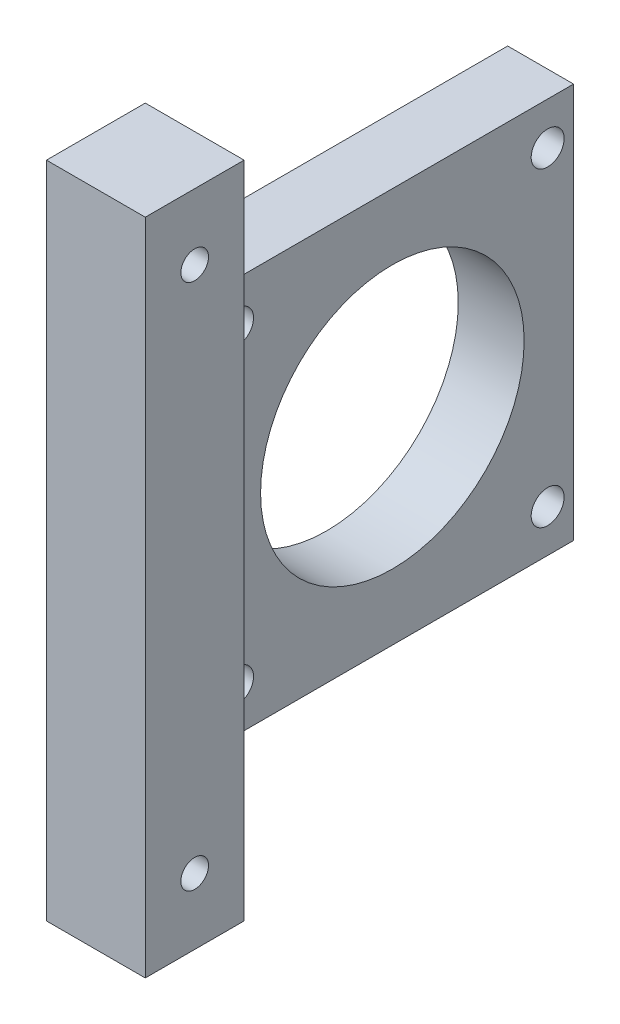
ISO-10303-21;
HEADER;
FILE_DESCRIPTION(('STEP AP214'),'2;1');
FILE_NAME('part.step','',(''),(''),'','','');
FILE_SCHEMA(('AUTOMOTIVE_DESIGN { 1 0 10303 214 1 1 1 1 }'));
ENDSEC;
DATA;
#1=APPLICATION_CONTEXT('core data for automotive mechanical design processes');
#2=APPLICATION_PROTOCOL_DEFINITION('international standard','automotive_design',2000,#1);
#3=PRODUCT_CONTEXT('',#1,'mechanical');
#4=PRODUCT('Part','Part','',(#3));
#5=PRODUCT_RELATED_PRODUCT_CATEGORY('part','',(#4));
#6=PRODUCT_DEFINITION_FORMATION('','',#4);
#7=PRODUCT_DEFINITION_CONTEXT('part definition',#1,'design');
#8=PRODUCT_DEFINITION('design','',#6,#7);
#9=PRODUCT_DEFINITION_SHAPE('','',#8);
#10=(LENGTH_UNIT() NAMED_UNIT(*) SI_UNIT(.MILLI.,.METRE.));
#11=(NAMED_UNIT(*) PLANE_ANGLE_UNIT() SI_UNIT($,.RADIAN.));
#12=(NAMED_UNIT(*) SI_UNIT($,.STERADIAN.) SOLID_ANGLE_UNIT());
#13=UNCERTAINTY_MEASURE_WITH_UNIT(LENGTH_MEASURE(1.E-05),#10,'distance_accuracy_value','');
#14=(GEOMETRIC_REPRESENTATION_CONTEXT(3) GLOBAL_UNCERTAINTY_ASSIGNED_CONTEXT((#13)) GLOBAL_UNIT_ASSIGNED_CONTEXT((#10,
#11,#12)) REPRESENTATION_CONTEXT('',''));
#15=CARTESIAN_POINT('',(0.,0.,0.));
#16=DIRECTION('',(0.,0.,1.));
#17=DIRECTION('',(1.,0.,0.));
#18=AXIS2_PLACEMENT_3D('',#15,#16,#17);
#19=CARTESIAN_POINT('',(10.,0.,0.));
#20=DIRECTION('',(1.,0.,0.));
#21=DIRECTION('',(0.,0.,-1.));
#22=AXIS2_PLACEMENT_3D('',#19,#20,#21);
#23=PLANE('',#22);
#24=CARTESIAN_POINT('',(10.,-23.57,-23.57));
#25=DIRECTION('',(1.,0.,0.));
#26=DIRECTION('',(0.,0.,-1.));
#27=AXIS2_PLACEMENT_3D('',#24,#25,#26);
#28=CIRCLE('',#27,2.5);
#29=CARTESIAN_POINT('',(10.,-23.57,-26.07));
#30=VERTEX_POINT('',#29);
#31=EDGE_CURVE('E126',#30,#30,#28,.T.);
#32=ORIENTED_EDGE('',*,*,#31,.F.);
#33=EDGE_LOOP('',(#32));
#34=FACE_BOUND('',#33,.T.);
#35=CARTESIAN_POINT('',(10.,23.57,23.57));
#36=DIRECTION('',(1.,0.,0.));
#37=DIRECTION('',(0.,0.,-1.));
#38=AXIS2_PLACEMENT_3D('',#35,#36,#37);
#39=CIRCLE('',#38,2.5);
#40=CARTESIAN_POINT('',(10.,23.57,21.07));
#41=VERTEX_POINT('',#40);
#42=EDGE_CURVE('E138',#41,#41,#39,.T.);
#43=ORIENTED_EDGE('',*,*,#42,.F.);
#44=EDGE_LOOP('',(#43));
#45=FACE_BOUND('',#44,.T.);
#46=DIRECTION('',(0.,-1.,0.));
#47=VECTOR('',#46,1.);
#48=CARTESIAN_POINT('',(10.,-30.,27.5));
#49=LINE('',#48,#47);
#50=CARTESIAN_POINT('',(10.,30.,27.5));
#51=VERTEX_POINT('',#50);
#52=CARTESIAN_POINT('',(10.,-30.,27.5));
#53=VERTEX_POINT('',#52);
#54=EDGE_CURVE('E149',#51,#53,#49,.T.);
#55=ORIENTED_EDGE('',*,*,#54,.T.);
#56=DIRECTION('',(0.,0.,-1.));
#57=VECTOR('',#56,1.);
#58=CARTESIAN_POINT('',(10.,-30.,-27.5));
#59=LINE('',#58,#57);
#60=CARTESIAN_POINT('',(10.,-30.,-27.5));
#61=VERTEX_POINT('',#60);
#62=EDGE_CURVE('E59',#53,#61,#59,.T.);
#63=ORIENTED_EDGE('',*,*,#62,.T.);
#64=DIRECTION('',(0.,1.,0.));
#65=VECTOR('',#64,1.);
#66=CARTESIAN_POINT('',(10.,-30.,-27.5));
#67=LINE('',#66,#65);
#68=CARTESIAN_POINT('',(10.,30.,-27.5));
#69=VERTEX_POINT('',#68);
#70=EDGE_CURVE('E153',#61,#69,#67,.T.);
#71=ORIENTED_EDGE('',*,*,#70,.T.);
#72=DIRECTION('',(0.,0.,1.));
#73=VECTOR('',#72,1.);
#74=CARTESIAN_POINT('',(10.,30.,-27.5));
#75=LINE('',#74,#73);
#76=EDGE_CURVE('E34',#69,#51,#75,.T.);
#77=ORIENTED_EDGE('',*,*,#76,.T.);
#78=EDGE_LOOP('',(#55,#63,#71,#77));
#79=FACE_BOUND('',#78,.T.);
#80=CARTESIAN_POINT('',(10.,0.,0.));
#81=DIRECTION('',(1.,0.,0.));
#82=DIRECTION('',(0.,0.,-1.));
#83=AXIS2_PLACEMENT_3D('',#80,#81,#82);
#84=CIRCLE('',#83,20.);
#85=CARTESIAN_POINT('',(10.,0.,-20.));
#86=VERTEX_POINT('',#85);
#87=EDGE_CURVE('E144',#86,#86,#84,.T.);
#88=ORIENTED_EDGE('',*,*,#87,.F.);
#89=EDGE_LOOP('',(#88));
#90=FACE_BOUND('',#89,.T.);
#91=CARTESIAN_POINT('',(10.,23.57,-23.57));
#92=DIRECTION('',(1.,0.,0.));
#93=DIRECTION('',(0.,0.,-1.));
#94=AXIS2_PLACEMENT_3D('',#91,#92,#93);
#95=CIRCLE('',#94,2.5);
#96=CARTESIAN_POINT('',(10.,23.57,-26.07));
#97=VERTEX_POINT('',#96);
#98=EDGE_CURVE('E132',#97,#97,#95,.T.);
#99=ORIENTED_EDGE('',*,*,#98,.F.);
#100=EDGE_LOOP('',(#99));
#101=FACE_BOUND('',#100,.T.);
#102=CARTESIAN_POINT('',(10.,-23.57,23.57));
#103=DIRECTION('',(1.,0.,0.));
#104=DIRECTION('',(0.,0.,-1.));
#105=AXIS2_PLACEMENT_3D('',#102,#103,#104);
#106=CIRCLE('',#105,2.5);
#107=CARTESIAN_POINT('',(10.,-23.57,21.07));
#108=VERTEX_POINT('',#107);
#109=EDGE_CURVE('E117',#108,#108,#106,.T.);
#110=ORIENTED_EDGE('',*,*,#109,.F.);
#111=EDGE_LOOP('',(#110));
#112=FACE_BOUND('',#111,.T.);
#113=ADVANCED_FACE('F17',(#34,#45,#79,#90,#101,#112),#23,.T.);
#114=CARTESIAN_POINT('',(0.,0.,0.));
#115=DIRECTION('',(1.,0.,0.));
#116=DIRECTION('',(0.,0.,-1.));
#117=AXIS2_PLACEMENT_3D('',#114,#115,#116);
#118=PLANE('',#117);
#119=CARTESIAN_POINT('',(0.,-40.,35.));
#120=DIRECTION('',(-1.,0.,0.));
#121=DIRECTION('',(0.,0.,1.));
#122=AXIS2_PLACEMENT_3D('',#119,#120,#121);
#123=CIRCLE('',#122,2.1);
#124=CARTESIAN_POINT('',(0.,-40.,37.1));
#125=VERTEX_POINT('',#124);
#126=EDGE_CURVE('E395',#125,#125,#123,.T.);
#127=ORIENTED_EDGE('',*,*,#126,.F.);
#128=EDGE_LOOP('',(#127));
#129=FACE_BOUND('',#128,.T.);
#130=CARTESIAN_POINT('',(0.,40.,35.));
#131=DIRECTION('',(-1.,0.,0.));
#132=DIRECTION('',(0.,0.,-1.));
#133=AXIS2_PLACEMENT_3D('',#130,#131,#132);
#134=CIRCLE('',#133,2.1);
#135=CARTESIAN_POINT('',(0.,40.,32.9));
#136=VERTEX_POINT('',#135);
#137=EDGE_CURVE('E400',#136,#136,#134,.T.);
#138=ORIENTED_EDGE('',*,*,#137,.F.);
#139=EDGE_LOOP('',(#138));
#140=FACE_BOUND('',#139,.T.);
#141=DIRECTION('',(0.,0.,-1.));
#142=VECTOR('',#141,1.);
#143=CARTESIAN_POINT('',(0.,-30.,-27.5));
#144=LINE('',#143,#142);
#145=CARTESIAN_POINT('',(0.,-30.,27.5));
#146=VERTEX_POINT('',#145);
#147=CARTESIAN_POINT('',(0.,-30.,-27.5));
#148=VERTEX_POINT('',#147);
#149=EDGE_CURVE('E47',#146,#148,#144,.T.);
#150=ORIENTED_EDGE('',*,*,#149,.F.);
#151=DIRECTION('',(0.,-1.,0.));
#152=VECTOR('',#151,1.);
#153=CARTESIAN_POINT('',(0.,-50.,27.5));
#154=LINE('',#153,#152);
#155=CARTESIAN_POINT('',(0.,-50.,27.5));
#156=VERTEX_POINT('',#155);
#157=EDGE_CURVE('E411',#146,#156,#154,.T.);
#158=ORIENTED_EDGE('',*,*,#157,.T.);
#159=DIRECTION('',(0.,0.,-1.));
#160=VECTOR('',#159,1.);
#161=CARTESIAN_POINT('',(0.,-50.,42.5));
#162=LINE('',#161,#160);
#163=CARTESIAN_POINT('',(0.,-50.,42.5));
#164=VERTEX_POINT('',#163);
#165=EDGE_CURVE('E119',#164,#156,#162,.T.);
#166=ORIENTED_EDGE('',*,*,#165,.F.);
#167=DIRECTION('',(0.,-1.,0.));
#168=VECTOR('',#167,1.);
#169=CARTESIAN_POINT('',(0.,-50.,42.5));
#170=LINE('',#169,#168);
#171=CARTESIAN_POINT('',(0.,50.,42.5));
#172=VERTEX_POINT('',#171);
#173=EDGE_CURVE('E99',#172,#164,#170,.T.);
#174=ORIENTED_EDGE('',*,*,#173,.F.);
#175=DIRECTION('',(0.,0.,-1.));
#176=VECTOR('',#175,1.);
#177=CARTESIAN_POINT('',(0.,50.,42.5));
#178=LINE('',#177,#176);
#179=CARTESIAN_POINT('',(0.,50.,27.5));
#180=VERTEX_POINT('',#179);
#181=EDGE_CURVE('E96',#172,#180,#178,.T.);
#182=ORIENTED_EDGE('',*,*,#181,.T.);
#183=CARTESIAN_POINT('',(0.,30.,27.5));
#184=VERTEX_POINT('',#183);
#185=EDGE_CURVE('E171',#180,#184,#154,.T.);
#186=ORIENTED_EDGE('',*,*,#185,.T.);
#187=DIRECTION('',(0.,0.,1.));
#188=VECTOR('',#187,1.);
#189=CARTESIAN_POINT('',(0.,30.,-27.5));
#190=LINE('',#189,#188);
#191=CARTESIAN_POINT('',(0.,30.,-27.5));
#192=VERTEX_POINT('',#191);
#193=EDGE_CURVE('E151',#192,#184,#190,.T.);
#194=ORIENTED_EDGE('',*,*,#193,.F.);
#195=DIRECTION('',(0.,1.,0.));
#196=VECTOR('',#195,1.);
#197=CARTESIAN_POINT('',(0.,-30.,-27.5));
#198=LINE('',#197,#196);
#199=EDGE_CURVE('E54',#148,#192,#198,.T.);
#200=ORIENTED_EDGE('',*,*,#199,.F.);
#201=EDGE_LOOP('',(#150,#158,#166,#174,#182,#186,#194,#200));
#202=FACE_BOUND('',#201,.T.);
#203=CARTESIAN_POINT('',(0.,0.,0.));
#204=DIRECTION('',(1.,0.,0.));
#205=DIRECTION('',(0.,0.,-1.));
#206=AXIS2_PLACEMENT_3D('',#203,#204,#205);
#207=CIRCLE('',#206,20.);
#208=CARTESIAN_POINT('',(0.,0.,-20.));
#209=VERTEX_POINT('',#208);
#210=EDGE_CURVE('E141',#209,#209,#207,.T.);
#211=ORIENTED_EDGE('',*,*,#210,.T.);
#212=EDGE_LOOP('',(#211));
#213=FACE_BOUND('',#212,.T.);
#214=CARTESIAN_POINT('',(0.,23.57,23.57));
#215=DIRECTION('',(1.,0.,0.));
#216=DIRECTION('',(0.,0.,-1.));
#217=AXIS2_PLACEMENT_3D('',#214,#215,#216);
#218=CIRCLE('',#217,2.5);
#219=CARTESIAN_POINT('',(0.,23.57,21.07));
#220=VERTEX_POINT('',#219);
#221=EDGE_CURVE('E135',#220,#220,#218,.T.);
#222=ORIENTED_EDGE('',*,*,#221,.T.);
#223=EDGE_LOOP('',(#222));
#224=FACE_BOUND('',#223,.T.);
#225=CARTESIAN_POINT('',(0.,23.57,-23.57));
#226=DIRECTION('',(1.,0.,0.));
#227=DIRECTION('',(0.,0.,-1.));
#228=AXIS2_PLACEMENT_3D('',#225,#226,#227);
#229=CIRCLE('',#228,2.5);
#230=CARTESIAN_POINT('',(0.,23.57,-26.07));
#231=VERTEX_POINT('',#230);
#232=EDGE_CURVE('E129',#231,#231,#229,.T.);
#233=ORIENTED_EDGE('',*,*,#232,.T.);
#234=EDGE_LOOP('',(#233));
#235=FACE_BOUND('',#234,.T.);
#236=CARTESIAN_POINT('',(0.,-23.57,-23.57));
#237=DIRECTION('',(1.,0.,0.));
#238=DIRECTION('',(0.,0.,-1.));
#239=AXIS2_PLACEMENT_3D('',#236,#237,#238);
#240=CIRCLE('',#239,2.5);
#241=CARTESIAN_POINT('',(0.,-23.57,-26.07));
#242=VERTEX_POINT('',#241);
#243=EDGE_CURVE('E124',#242,#242,#240,.T.);
#244=ORIENTED_EDGE('',*,*,#243,.T.);
#245=EDGE_LOOP('',(#244));
#246=FACE_BOUND('',#245,.T.);
#247=CARTESIAN_POINT('',(0.,-23.57,23.57));
#248=DIRECTION('',(1.,0.,0.));
#249=DIRECTION('',(0.,0.,-1.));
#250=AXIS2_PLACEMENT_3D('',#247,#248,#249);
#251=CIRCLE('',#250,2.5);
#252=CARTESIAN_POINT('',(0.,-23.57,21.07));
#253=VERTEX_POINT('',#252);
#254=EDGE_CURVE('E114',#253,#253,#251,.T.);
#255=ORIENTED_EDGE('',*,*,#254,.T.);
#256=EDGE_LOOP('',(#255));
#257=FACE_BOUND('',#256,.T.);
#258=ADVANCED_FACE('F167',(#129,#140,#202,#213,#224,#235,#246,#257),#118,.F.);
#259=CARTESIAN_POINT('',(10.,-30.,-27.5));
#260=DIRECTION('',(0.,1.,0.));
#261=DIRECTION('',(0.,0.,1.));
#262=AXIS2_PLACEMENT_3D('',#259,#260,#261);
#263=PLANE('',#262);
#264=ORIENTED_EDGE('',*,*,#149,.T.);
#265=DIRECTION('',(-1.,0.,0.));
#266=VECTOR('',#265,1.);
#267=CARTESIAN_POINT('',(10.,-30.,-27.5));
#268=LINE('',#267,#266);
#269=EDGE_CURVE('E26',#61,#148,#268,.T.);
#270=ORIENTED_EDGE('',*,*,#269,.F.);
#271=ORIENTED_EDGE('',*,*,#62,.F.);
#272=DIRECTION('',(-1.,0.,0.));
#273=VECTOR('',#272,1.);
#274=CARTESIAN_POINT('',(10.,-30.,27.5));
#275=LINE('',#274,#273);
#276=EDGE_CURVE('E11',#53,#146,#275,.T.);
#277=ORIENTED_EDGE('',*,*,#276,.T.);
#278=EDGE_LOOP('',(#264,#270,#271,#277));
#279=FACE_BOUND('',#278,.T.);
#280=ADVANCED_FACE('F19',(#279),#263,.F.);
#281=CARTESIAN_POINT('',(10.,-30.,-27.5));
#282=DIRECTION('',(0.,0.,1.));
#283=DIRECTION('',(1.,0.,0.));
#284=AXIS2_PLACEMENT_3D('',#281,#282,#283);
#285=PLANE('',#284);
#286=ORIENTED_EDGE('',*,*,#199,.T.);
#287=DIRECTION('',(-1.,0.,0.));
#288=VECTOR('',#287,1.);
#289=CARTESIAN_POINT('',(10.,30.,-27.5));
#290=LINE('',#289,#288);
#291=EDGE_CURVE('E162',#69,#192,#290,.T.);
#292=ORIENTED_EDGE('',*,*,#291,.F.);
#293=ORIENTED_EDGE('',*,*,#70,.F.);
#294=ORIENTED_EDGE('',*,*,#269,.T.);
#295=EDGE_LOOP('',(#286,#292,#293,#294));
#296=FACE_BOUND('',#295,.T.);
#297=ADVANCED_FACE('F164',(#296),#285,.F.);
#298=CARTESIAN_POINT('',(10.,30.,-27.5));
#299=DIRECTION('',(0.,-1.,0.));
#300=DIRECTION('',(0.,0.,-1.));
#301=AXIS2_PLACEMENT_3D('',#298,#299,#300);
#302=PLANE('',#301);
#303=ORIENTED_EDGE('',*,*,#193,.T.);
#304=DIRECTION('',(-1.,0.,0.));
#305=VECTOR('',#304,1.);
#306=CARTESIAN_POINT('',(10.,30.,27.5));
#307=LINE('',#306,#305);
#308=EDGE_CURVE('E156',#51,#184,#307,.T.);
#309=ORIENTED_EDGE('',*,*,#308,.F.);
#310=ORIENTED_EDGE('',*,*,#76,.F.);
#311=ORIENTED_EDGE('',*,*,#291,.T.);
#312=EDGE_LOOP('',(#303,#309,#310,#311));
#313=FACE_BOUND('',#312,.T.);
#314=ADVANCED_FACE('F173',(#313),#302,.F.);
#315=CARTESIAN_POINT('',(10.,0.,0.));
#316=DIRECTION('',(-1.,0.,0.));
#317=DIRECTION('',(0.,0.,1.));
#318=AXIS2_PLACEMENT_3D('',#315,#316,#317);
#319=CYLINDRICAL_SURFACE('',#318,20.);
#320=ORIENTED_EDGE('',*,*,#87,.T.);
#321=EDGE_LOOP('',(#320));
#322=FACE_BOUND('',#321,.T.);
#323=ORIENTED_EDGE('',*,*,#210,.F.);
#324=EDGE_LOOP('',(#323));
#325=FACE_BOUND('',#324,.T.);
#326=ADVANCED_FACE('F210',(#322,#325),#319,.F.);
#327=CARTESIAN_POINT('',(10.,23.57,23.57));
#328=DIRECTION('',(-1.,0.,0.));
#329=DIRECTION('',(0.,0.,1.));
#330=AXIS2_PLACEMENT_3D('',#327,#328,#329);
#331=CYLINDRICAL_SURFACE('',#330,2.5);
#332=ORIENTED_EDGE('',*,*,#42,.T.);
#333=EDGE_LOOP('',(#332));
#334=FACE_BOUND('',#333,.T.);
#335=ORIENTED_EDGE('',*,*,#221,.F.);
#336=EDGE_LOOP('',(#335));
#337=FACE_BOUND('',#336,.T.);
#338=ADVANCED_FACE('F233',(#334,#337),#331,.F.);
#339=CARTESIAN_POINT('',(10.,23.57,-23.57));
#340=DIRECTION('',(-1.,0.,0.));
#341=DIRECTION('',(0.,0.,1.));
#342=AXIS2_PLACEMENT_3D('',#339,#340,#341);
#343=CYLINDRICAL_SURFACE('',#342,2.5);
#344=ORIENTED_EDGE('',*,*,#98,.T.);
#345=EDGE_LOOP('',(#344));
#346=FACE_BOUND('',#345,.T.);
#347=ORIENTED_EDGE('',*,*,#232,.F.);
#348=EDGE_LOOP('',(#347));
#349=FACE_BOUND('',#348,.T.);
#350=ADVANCED_FACE('F241',(#346,#349),#343,.F.);
#351=CARTESIAN_POINT('',(10.,-23.57,-23.57));
#352=DIRECTION('',(-1.,0.,0.));
#353=DIRECTION('',(0.,0.,1.));
#354=AXIS2_PLACEMENT_3D('',#351,#352,#353);
#355=CYLINDRICAL_SURFACE('',#354,2.5);
#356=ORIENTED_EDGE('',*,*,#31,.T.);
#357=EDGE_LOOP('',(#356));
#358=FACE_BOUND('',#357,.T.);
#359=ORIENTED_EDGE('',*,*,#243,.F.);
#360=EDGE_LOOP('',(#359));
#361=FACE_BOUND('',#360,.T.);
#362=ADVANCED_FACE('F192',(#358,#361),#355,.F.);
#363=CARTESIAN_POINT('',(10.,-23.57,23.57));
#364=DIRECTION('',(-1.,0.,0.));
#365=DIRECTION('',(0.,0.,1.));
#366=AXIS2_PLACEMENT_3D('',#363,#364,#365);
#367=CYLINDRICAL_SURFACE('',#366,2.5);
#368=ORIENTED_EDGE('',*,*,#109,.T.);
#369=EDGE_LOOP('',(#368));
#370=FACE_BOUND('',#369,.T.);
#371=ORIENTED_EDGE('',*,*,#254,.F.);
#372=EDGE_LOOP('',(#371));
#373=FACE_BOUND('',#372,.T.);
#374=ADVANCED_FACE('F189',(#370,#373),#367,.F.);
#375=CARTESIAN_POINT('',(0.,0.,27.5));
#376=DIRECTION('',(0.,0.,-1.));
#377=DIRECTION('',(-1.,0.,0.));
#378=AXIS2_PLACEMENT_3D('',#375,#376,#377);
#379=PLANE('',#378);
#380=ORIENTED_EDGE('',*,*,#276,.F.);
#381=ORIENTED_EDGE('',*,*,#54,.F.);
#382=ORIENTED_EDGE('',*,*,#308,.T.);
#383=ORIENTED_EDGE('',*,*,#185,.F.);
#384=DIRECTION('',(-1.,0.,0.));
#385=VECTOR('',#384,1.);
#386=CARTESIAN_POINT('',(0.,50.,27.5));
#387=LINE('',#386,#385);
#388=CARTESIAN_POINT('',(15.,50.,27.5));
#389=VERTEX_POINT('',#388);
#390=EDGE_CURVE('E409',#389,#180,#387,.T.);
#391=ORIENTED_EDGE('',*,*,#390,.F.);
#392=DIRECTION('',(0.,1.,0.));
#393=VECTOR('',#392,1.);
#394=CARTESIAN_POINT('',(15.,-50.,27.5));
#395=LINE('',#394,#393);
#396=CARTESIAN_POINT('',(15.,-50.,27.5));
#397=VERTEX_POINT('',#396);
#398=EDGE_CURVE('E113',#397,#389,#395,.T.);
#399=ORIENTED_EDGE('',*,*,#398,.F.);
#400=DIRECTION('',(1.,0.,0.));
#401=VECTOR('',#400,1.);
#402=CARTESIAN_POINT('',(0.,-50.,27.5));
#403=LINE('',#402,#401);
#404=EDGE_CURVE('E109',#156,#397,#403,.T.);
#405=ORIENTED_EDGE('',*,*,#404,.F.);
#406=ORIENTED_EDGE('',*,*,#157,.F.);
#407=EDGE_LOOP('',(#380,#381,#382,#383,#391,#399,#405,#406));
#408=FACE_BOUND('',#407,.T.);
#409=ADVANCED_FACE('F177',(#408),#379,.T.);
#410=CARTESIAN_POINT('',(15.,-50.,42.5));
#411=DIRECTION('',(-1.,0.,0.));
#412=DIRECTION('',(0.,0.,1.));
#413=AXIS2_PLACEMENT_3D('',#410,#411,#412);
#414=PLANE('',#413);
#415=CARTESIAN_POINT('',(15.,-40.,35.));
#416=DIRECTION('',(-1.,0.,0.));
#417=DIRECTION('',(0.,0.,1.));
#418=AXIS2_PLACEMENT_3D('',#415,#416,#417);
#419=CIRCLE('',#418,2.1);
#420=CARTESIAN_POINT('',(15.,-40.,37.1));
#421=VERTEX_POINT('',#420);
#422=EDGE_CURVE('E393',#421,#421,#419,.T.);
#423=ORIENTED_EDGE('',*,*,#422,.T.);
#424=EDGE_LOOP('',(#423));
#425=FACE_BOUND('',#424,.T.);
#426=CARTESIAN_POINT('',(15.,40.,35.));
#427=DIRECTION('',(-1.,0.,0.));
#428=DIRECTION('',(0.,0.,-1.));
#429=AXIS2_PLACEMENT_3D('',#426,#427,#428);
#430=CIRCLE('',#429,2.1);
#431=CARTESIAN_POINT('',(15.,40.,32.9));
#432=VERTEX_POINT('',#431);
#433=EDGE_CURVE('E396',#432,#432,#430,.T.);
#434=ORIENTED_EDGE('',*,*,#433,.T.);
#435=EDGE_LOOP('',(#434));
#436=FACE_BOUND('',#435,.T.);
#437=ORIENTED_EDGE('',*,*,#398,.T.);
#438=DIRECTION('',(0.,0.,-1.));
#439=VECTOR('',#438,1.);
#440=CARTESIAN_POINT('',(15.,50.,42.5));
#441=LINE('',#440,#439);
#442=CARTESIAN_POINT('',(15.,50.,42.5));
#443=VERTEX_POINT('',#442);
#444=EDGE_CURVE('E93',#443,#389,#441,.T.);
#445=ORIENTED_EDGE('',*,*,#444,.F.);
#446=DIRECTION('',(0.,1.,0.));
#447=VECTOR('',#446,1.);
#448=CARTESIAN_POINT('',(15.,-50.,42.5));
#449=LINE('',#448,#447);
#450=CARTESIAN_POINT('',(15.,-50.,42.5));
#451=VERTEX_POINT('',#450);
#452=EDGE_CURVE('E100',#451,#443,#449,.T.);
#453=ORIENTED_EDGE('',*,*,#452,.F.);
#454=DIRECTION('',(0.,0.,-1.));
#455=VECTOR('',#454,1.);
#456=CARTESIAN_POINT('',(15.,-50.,42.5));
#457=LINE('',#456,#455);
#458=EDGE_CURVE('E407',#451,#397,#457,.T.);
#459=ORIENTED_EDGE('',*,*,#458,.T.);
#460=EDGE_LOOP('',(#437,#445,#453,#459));
#461=FACE_BOUND('',#460,.T.);
#462=ADVANCED_FACE('F111',(#425,#436,#461),#414,.F.);
#463=CARTESIAN_POINT('',(0.,50.,42.5));
#464=DIRECTION('',(0.,-1.,0.));
#465=DIRECTION('',(0.,0.,-1.));
#466=AXIS2_PLACEMENT_3D('',#463,#464,#465);
#467=PLANE('',#466);
#468=ORIENTED_EDGE('',*,*,#390,.T.);
#469=ORIENTED_EDGE('',*,*,#181,.F.);
#470=DIRECTION('',(-1.,0.,0.));
#471=VECTOR('',#470,1.);
#472=CARTESIAN_POINT('',(0.,50.,42.5));
#473=LINE('',#472,#471);
#474=EDGE_CURVE('E89',#443,#172,#473,.T.);
#475=ORIENTED_EDGE('',*,*,#474,.F.);
#476=ORIENTED_EDGE('',*,*,#444,.T.);
#477=EDGE_LOOP('',(#468,#469,#475,#476));
#478=FACE_BOUND('',#477,.T.);
#479=ADVANCED_FACE('F91',(#478),#467,.F.);
#480=CARTESIAN_POINT('',(0.,-50.,42.5));
#481=DIRECTION('',(0.,1.,0.));
#482=DIRECTION('',(0.,0.,1.));
#483=AXIS2_PLACEMENT_3D('',#480,#481,#482);
#484=PLANE('',#483);
#485=ORIENTED_EDGE('',*,*,#404,.T.);
#486=ORIENTED_EDGE('',*,*,#458,.F.);
#487=DIRECTION('',(1.,0.,0.));
#488=VECTOR('',#487,1.);
#489=CARTESIAN_POINT('',(0.,-50.,42.5));
#490=LINE('',#489,#488);
#491=EDGE_CURVE('E105',#164,#451,#490,.T.);
#492=ORIENTED_EDGE('',*,*,#491,.F.);
#493=ORIENTED_EDGE('',*,*,#165,.T.);
#494=EDGE_LOOP('',(#485,#486,#492,#493));
#495=FACE_BOUND('',#494,.T.);
#496=ADVANCED_FACE('F287',(#495),#484,.F.);
#497=CARTESIAN_POINT('',(0.,0.,42.5));
#498=DIRECTION('',(0.,0.,-1.));
#499=DIRECTION('',(-1.,0.,0.));
#500=AXIS2_PLACEMENT_3D('',#497,#498,#499);
#501=PLANE('',#500);
#502=ORIENTED_EDGE('',*,*,#452,.T.);
#503=ORIENTED_EDGE('',*,*,#474,.T.);
#504=ORIENTED_EDGE('',*,*,#173,.T.);
#505=ORIENTED_EDGE('',*,*,#491,.T.);
#506=EDGE_LOOP('',(#502,#503,#504,#505));
#507=FACE_BOUND('',#506,.T.);
#508=ADVANCED_FACE('F103',(#507),#501,.F.);
#509=CARTESIAN_POINT('',(15.,40.,35.));
#510=DIRECTION('',(-1.,0.,0.));
#511=DIRECTION('',(0.,0.,1.));
#512=AXIS2_PLACEMENT_3D('',#509,#510,#511);
#513=CYLINDRICAL_SURFACE('',#512,2.1);
#514=ORIENTED_EDGE('',*,*,#433,.F.);
#515=EDGE_LOOP('',(#514));
#516=FACE_BOUND('',#515,.T.);
#517=ORIENTED_EDGE('',*,*,#137,.T.);
#518=EDGE_LOOP('',(#517));
#519=FACE_BOUND('',#518,.T.);
#520=ADVANCED_FACE('F303',(#516,#519),#513,.F.);
#521=CARTESIAN_POINT('',(15.,-40.,35.));
#522=DIRECTION('',(-1.,0.,0.));
#523=DIRECTION('',(0.,0.,1.));
#524=AXIS2_PLACEMENT_3D('',#521,#522,#523);
#525=CYLINDRICAL_SURFACE('',#524,2.1);
#526=ORIENTED_EDGE('',*,*,#422,.F.);
#527=EDGE_LOOP('',(#526));
#528=FACE_BOUND('',#527,.T.);
#529=ORIENTED_EDGE('',*,*,#126,.T.);
#530=EDGE_LOOP('',(#529));
#531=FACE_BOUND('',#530,.T.);
#532=ADVANCED_FACE('F311',(#528,#531),#525,.F.);
#533=CLOSED_SHELL('',(#113,#258,#280,#297,#314,#326,#338,#350,#362,#374,#409,#462,#479,#496,
#508,#520,#532));
#534=MANIFOLD_SOLID_BREP('B1',#533);
#535=ADVANCED_BREP_SHAPE_REPRESENTATION('',(#18,#534),#14);
#536=SHAPE_DEFINITION_REPRESENTATION(#9,#535);
ENDSEC;
END-ISO-10303-21;
